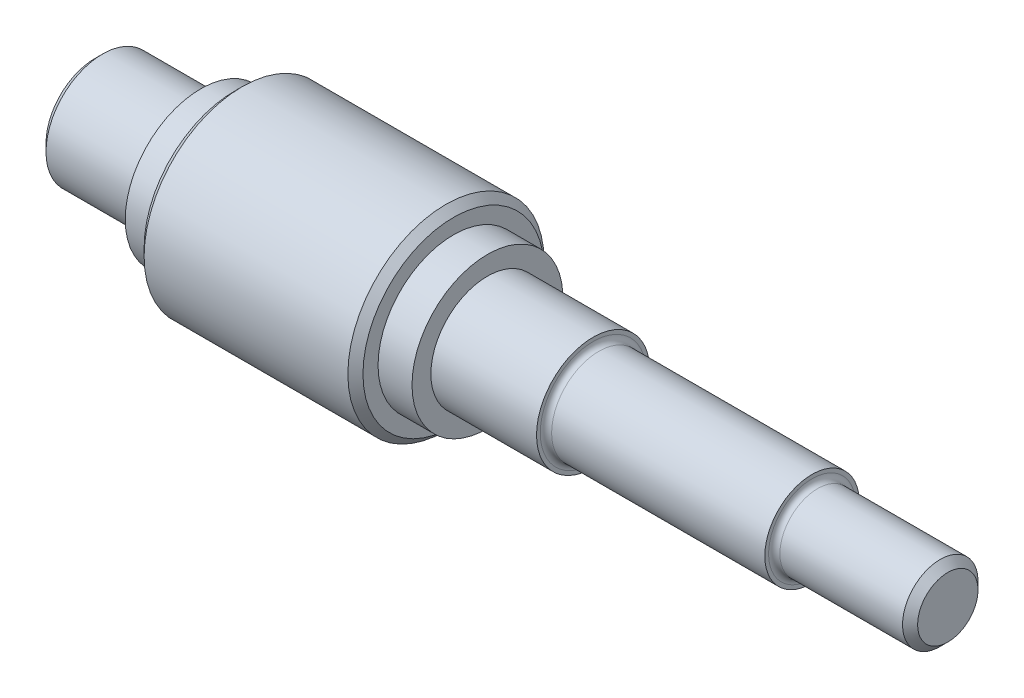
ISO-10303-21;
HEADER;
FILE_DESCRIPTION(('STEP AP214'),'2;1');
FILE_NAME('part.step','',(''),(''),'','','');
FILE_SCHEMA(('AUTOMOTIVE_DESIGN { 1 0 10303 214 1 1 1 1 }'));
ENDSEC;
DATA;
#1=APPLICATION_CONTEXT('core data for automotive mechanical design processes');
#2=APPLICATION_PROTOCOL_DEFINITION('international standard','automotive_design',2000,#1);
#3=PRODUCT_CONTEXT('',#1,'mechanical');
#4=PRODUCT('Part','Part','',(#3));
#5=PRODUCT_RELATED_PRODUCT_CATEGORY('part','',(#4));
#6=PRODUCT_DEFINITION_FORMATION('','',#4);
#7=PRODUCT_DEFINITION_CONTEXT('part definition',#1,'design');
#8=PRODUCT_DEFINITION('design','',#6,#7);
#9=PRODUCT_DEFINITION_SHAPE('','',#8);
#10=(LENGTH_UNIT() NAMED_UNIT(*) SI_UNIT(.MILLI.,.METRE.));
#11=(NAMED_UNIT(*) PLANE_ANGLE_UNIT() SI_UNIT($,.RADIAN.));
#12=(NAMED_UNIT(*) SI_UNIT($,.STERADIAN.) SOLID_ANGLE_UNIT());
#13=UNCERTAINTY_MEASURE_WITH_UNIT(LENGTH_MEASURE(1.E-05),#10,'distance_accuracy_value','');
#14=(GEOMETRIC_REPRESENTATION_CONTEXT(3) GLOBAL_UNCERTAINTY_ASSIGNED_CONTEXT((#13)) GLOBAL_UNIT_ASSIGNED_CONTEXT((#10,
#11,#12)) REPRESENTATION_CONTEXT('',''));
#15=CARTESIAN_POINT('',(0.,0.,0.));
#16=DIRECTION('',(0.,0.,1.));
#17=DIRECTION('',(1.,0.,0.));
#18=AXIS2_PLACEMENT_3D('',#15,#16,#17);
#19=CARTESIAN_POINT('',(-108.930747922438,0.,0.));
#20=DIRECTION('',(1.,0.,0.));
#21=DIRECTION('',(0.,0.,-1.));
#22=AXIS2_PLACEMENT_3D('',#19,#20,#21);
#23=PLANE('',#22);
#24=CARTESIAN_POINT('',(-108.930747922438,0.,0.));
#25=DIRECTION('',(-1.,0.,0.));
#26=DIRECTION('',(0.,0.,1.));
#27=AXIS2_PLACEMENT_3D('',#24,#25,#26);
#28=CIRCLE('',#27,13.);
#29=CARTESIAN_POINT('',(-108.930747922438,0.,13.));
#30=VERTEX_POINT('',#29);
#31=EDGE_CURVE('E159',#30,#30,#28,.T.);
#32=ORIENTED_EDGE('',*,*,#31,.T.);
#33=EDGE_LOOP('',(#32));
#34=FACE_BOUND('',#33,.T.);
#35=ADVANCED_FACE('F34',(#34),#23,.F.);
#36=CARTESIAN_POINT('',(-106.930747922438,0.,0.));
#37=DIRECTION('',(1.,0.,0.));
#38=DIRECTION('',(0.,0.,-1.));
#39=AXIS2_PLACEMENT_3D('',#36,#37,#38);
#40=CONICAL_SURFACE('',#39,15.,0.785398163397448);
#41=ORIENTED_EDGE('',*,*,#31,.F.);
#42=EDGE_LOOP('',(#41));
#43=FACE_BOUND('',#42,.T.);
#44=CARTESIAN_POINT('',(-106.930747922438,0.,0.));
#45=DIRECTION('',(-1.,0.,0.));
#46=DIRECTION('',(0.,0.,1.));
#47=AXIS2_PLACEMENT_3D('',#44,#45,#46);
#48=CIRCLE('',#47,15.);
#49=CARTESIAN_POINT('',(-106.930747922438,0.,15.));
#50=VERTEX_POINT('',#49);
#51=EDGE_CURVE('E156',#50,#50,#48,.T.);
#52=ORIENTED_EDGE('',*,*,#51,.T.);
#53=EDGE_LOOP('',(#52));
#54=FACE_BOUND('',#53,.T.);
#55=ADVANCED_FACE('F206',(#43,#54),#40,.T.);
#56=CARTESIAN_POINT('',(-108.930747922438,0.,0.));
#57=DIRECTION('',(-1.,0.,0.));
#58=DIRECTION('',(0.,0.,1.));
#59=AXIS2_PLACEMENT_3D('',#56,#57,#58);
#60=CYLINDRICAL_SURFACE('',#59,15.);
#61=ORIENTED_EDGE('',*,*,#51,.F.);
#62=EDGE_LOOP('',(#61));
#63=FACE_BOUND('',#62,.T.);
#64=CARTESIAN_POINT('',(-80.9307479224376,0.,0.));
#65=DIRECTION('',(-1.,0.,0.));
#66=DIRECTION('',(0.,0.,1.));
#67=AXIS2_PLACEMENT_3D('',#64,#65,#66);
#68=CIRCLE('',#67,15.);
#69=CARTESIAN_POINT('',(-80.9307479224376,0.,15.));
#70=VERTEX_POINT('',#69);
#71=EDGE_CURVE('E153',#70,#70,#68,.T.);
#72=ORIENTED_EDGE('',*,*,#71,.T.);
#73=EDGE_LOOP('',(#72));
#74=FACE_BOUND('',#73,.T.);
#75=ADVANCED_FACE('F211',(#63,#74),#60,.T.);
#76=CARTESIAN_POINT('',(-80.9307479224376,15.,0.));
#77=DIRECTION('',(1.,0.,0.));
#78=DIRECTION('',(0.,0.,-1.));
#79=AXIS2_PLACEMENT_3D('',#76,#77,#78);
#80=PLANE('',#79);
#81=ORIENTED_EDGE('',*,*,#71,.F.);
#82=EDGE_LOOP('',(#81));
#83=FACE_BOUND('',#82,.T.);
#84=CARTESIAN_POINT('',(-80.9307479224376,0.,0.));
#85=DIRECTION('',(-1.,0.,0.));
#86=DIRECTION('',(0.,0.,1.));
#87=AXIS2_PLACEMENT_3D('',#84,#85,#86);
#88=CIRCLE('',#87,20.);
#89=CARTESIAN_POINT('',(-80.9307479224376,0.,20.));
#90=VERTEX_POINT('',#89);
#91=EDGE_CURVE('E150',#90,#90,#88,.T.);
#92=ORIENTED_EDGE('',*,*,#91,.T.);
#93=EDGE_LOOP('',(#92));
#94=FACE_BOUND('',#93,.T.);
#95=ADVANCED_FACE('F219',(#83,#94),#80,.F.);
#96=CARTESIAN_POINT('',(-108.930747922438,0.,0.));
#97=DIRECTION('',(-1.,0.,0.));
#98=DIRECTION('',(0.,0.,1.));
#99=AXIS2_PLACEMENT_3D('',#96,#97,#98);
#100=CYLINDRICAL_SURFACE('',#99,20.);
#101=ORIENTED_EDGE('',*,*,#91,.F.);
#102=EDGE_LOOP('',(#101));
#103=FACE_BOUND('',#102,.T.);
#104=CARTESIAN_POINT('',(-71.9307479224377,0.,0.));
#105=DIRECTION('',(-1.,0.,0.));
#106=DIRECTION('',(0.,0.,1.));
#107=AXIS2_PLACEMENT_3D('',#104,#105,#106);
#108=CIRCLE('',#107,20.);
#109=CARTESIAN_POINT('',(-71.9307479224377,0.,20.));
#110=VERTEX_POINT('',#109);
#111=EDGE_CURVE('E147',#110,#110,#108,.T.);
#112=ORIENTED_EDGE('',*,*,#111,.T.);
#113=EDGE_LOOP('',(#112));
#114=FACE_BOUND('',#113,.T.);
#115=ADVANCED_FACE('F225',(#103,#114),#100,.T.);
#116=CARTESIAN_POINT('',(-71.9307479224377,20.,0.));
#117=DIRECTION('',(1.,0.,0.));
#118=DIRECTION('',(0.,0.,-1.));
#119=AXIS2_PLACEMENT_3D('',#116,#117,#118);
#120=PLANE('',#119);
#121=ORIENTED_EDGE('',*,*,#111,.F.);
#122=EDGE_LOOP('',(#121));
#123=FACE_BOUND('',#122,.T.);
#124=CARTESIAN_POINT('',(-71.9307479224377,0.,0.));
#125=DIRECTION('',(-1.,0.,0.));
#126=DIRECTION('',(0.,0.,1.));
#127=AXIS2_PLACEMENT_3D('',#124,#125,#126);
#128=CIRCLE('',#127,24.);
#129=CARTESIAN_POINT('',(-71.9307479224377,0.,24.));
#130=VERTEX_POINT('',#129);
#131=EDGE_CURVE('E144',#130,#130,#128,.T.);
#132=ORIENTED_EDGE('',*,*,#131,.T.);
#133=EDGE_LOOP('',(#132));
#134=FACE_BOUND('',#133,.T.);
#135=ADVANCED_FACE('F231',(#123,#134),#120,.F.);
#136=CARTESIAN_POINT('',(-69.9307479224377,0.,0.));
#137=DIRECTION('',(1.,0.,0.));
#138=DIRECTION('',(0.,0.,-1.));
#139=AXIS2_PLACEMENT_3D('',#136,#137,#138);
#140=CONICAL_SURFACE('',#139,26.,0.785398163397448);
#141=ORIENTED_EDGE('',*,*,#131,.F.);
#142=EDGE_LOOP('',(#141));
#143=FACE_BOUND('',#142,.T.);
#144=CARTESIAN_POINT('',(-69.9307479224377,0.,0.));
#145=DIRECTION('',(-1.,0.,0.));
#146=DIRECTION('',(0.,0.,1.));
#147=AXIS2_PLACEMENT_3D('',#144,#145,#146);
#148=CIRCLE('',#147,26.);
#149=CARTESIAN_POINT('',(-69.9307479224377,0.,26.));
#150=VERTEX_POINT('',#149);
#151=EDGE_CURVE('E141',#150,#150,#148,.T.);
#152=ORIENTED_EDGE('',*,*,#151,.T.);
#153=EDGE_LOOP('',(#152));
#154=FACE_BOUND('',#153,.T.);
#155=ADVANCED_FACE('F237',(#143,#154),#140,.T.);
#156=CARTESIAN_POINT('',(-108.930747922438,0.,0.));
#157=DIRECTION('',(-1.,0.,0.));
#158=DIRECTION('',(0.,0.,1.));
#159=AXIS2_PLACEMENT_3D('',#156,#157,#158);
#160=CYLINDRICAL_SURFACE('',#159,26.);
#161=ORIENTED_EDGE('',*,*,#151,.F.);
#162=EDGE_LOOP('',(#161));
#163=FACE_BOUND('',#162,.T.);
#164=CARTESIAN_POINT('',(-15.9307479224377,0.,0.));
#165=DIRECTION('',(-1.,0.,0.));
#166=DIRECTION('',(0.,0.,1.));
#167=AXIS2_PLACEMENT_3D('',#164,#165,#166);
#168=CIRCLE('',#167,26.);
#169=CARTESIAN_POINT('',(-15.9307479224377,0.,26.));
#170=VERTEX_POINT('',#169);
#171=EDGE_CURVE('E138',#170,#170,#168,.T.);
#172=ORIENTED_EDGE('',*,*,#171,.T.);
#173=EDGE_LOOP('',(#172));
#174=FACE_BOUND('',#173,.T.);
#175=ADVANCED_FACE('F243',(#163,#174),#160,.T.);
#176=CARTESIAN_POINT('',(-13.9307479224377,0.,0.));
#177=DIRECTION('',(-1.,0.,0.));
#178=DIRECTION('',(0.,0.,1.));
#179=AXIS2_PLACEMENT_3D('',#176,#177,#178);
#180=CONICAL_SURFACE('',#179,24.,0.785398163397448);
#181=ORIENTED_EDGE('',*,*,#171,.F.);
#182=EDGE_LOOP('',(#181));
#183=FACE_BOUND('',#182,.T.);
#184=CARTESIAN_POINT('',(-13.9307479224377,0.,0.));
#185=DIRECTION('',(-1.,0.,0.));
#186=DIRECTION('',(0.,0.,1.));
#187=AXIS2_PLACEMENT_3D('',#184,#185,#186);
#188=CIRCLE('',#187,24.);
#189=CARTESIAN_POINT('',(-13.9307479224377,0.,24.));
#190=VERTEX_POINT('',#189);
#191=EDGE_CURVE('E135',#190,#190,#188,.T.);
#192=ORIENTED_EDGE('',*,*,#191,.T.);
#193=EDGE_LOOP('',(#192));
#194=FACE_BOUND('',#193,.T.);
#195=ADVANCED_FACE('F249',(#183,#194),#180,.T.);
#196=CARTESIAN_POINT('',(-13.9307479224377,24.,0.));
#197=DIRECTION('',(-1.,0.,0.));
#198=DIRECTION('',(0.,0.,1.));
#199=AXIS2_PLACEMENT_3D('',#196,#197,#198);
#200=PLANE('',#199);
#201=ORIENTED_EDGE('',*,*,#191,.F.);
#202=EDGE_LOOP('',(#201));
#203=FACE_BOUND('',#202,.T.);
#204=CARTESIAN_POINT('',(-13.9307479224377,0.,0.));
#205=DIRECTION('',(-1.,0.,0.));
#206=DIRECTION('',(0.,0.,1.));
#207=AXIS2_PLACEMENT_3D('',#204,#205,#206);
#208=CIRCLE('',#207,20.);
#209=CARTESIAN_POINT('',(-13.9307479224377,0.,20.));
#210=VERTEX_POINT('',#209);
#211=EDGE_CURVE('E132',#210,#210,#208,.T.);
#212=ORIENTED_EDGE('',*,*,#211,.T.);
#213=EDGE_LOOP('',(#212));
#214=FACE_BOUND('',#213,.T.);
#215=ADVANCED_FACE('F255',(#203,#214),#200,.F.);
#216=CARTESIAN_POINT('',(-108.930747922438,0.,0.));
#217=DIRECTION('',(-1.,0.,0.));
#218=DIRECTION('',(0.,0.,1.));
#219=AXIS2_PLACEMENT_3D('',#216,#217,#218);
#220=CYLINDRICAL_SURFACE('',#219,20.);
#221=ORIENTED_EDGE('',*,*,#211,.F.);
#222=EDGE_LOOP('',(#221));
#223=FACE_BOUND('',#222,.T.);
#224=CARTESIAN_POINT('',(-4.93074792243765,0.,0.));
#225=DIRECTION('',(-1.,0.,0.));
#226=DIRECTION('',(0.,0.,1.));
#227=AXIS2_PLACEMENT_3D('',#224,#225,#226);
#228=CIRCLE('',#227,20.);
#229=CARTESIAN_POINT('',(-4.93074792243765,0.,20.));
#230=VERTEX_POINT('',#229);
#231=EDGE_CURVE('E129',#230,#230,#228,.T.);
#232=ORIENTED_EDGE('',*,*,#231,.T.);
#233=EDGE_LOOP('',(#232));
#234=FACE_BOUND('',#233,.T.);
#235=ADVANCED_FACE('F261',(#223,#234),#220,.T.);
#236=CARTESIAN_POINT('',(-4.93074792243766,20.,0.));
#237=DIRECTION('',(-1.,0.,0.));
#238=DIRECTION('',(0.,0.,1.));
#239=AXIS2_PLACEMENT_3D('',#236,#237,#238);
#240=PLANE('',#239);
#241=ORIENTED_EDGE('',*,*,#231,.F.);
#242=EDGE_LOOP('',(#241));
#243=FACE_BOUND('',#242,.T.);
#244=CARTESIAN_POINT('',(-4.93074792243765,0.,0.));
#245=DIRECTION('',(-1.,0.,0.));
#246=DIRECTION('',(0.,0.,1.));
#247=AXIS2_PLACEMENT_3D('',#244,#245,#246);
#248=CIRCLE('',#247,15.);
#249=CARTESIAN_POINT('',(-4.93074792243765,0.,15.));
#250=VERTEX_POINT('',#249);
#251=EDGE_CURVE('E126',#250,#250,#248,.T.);
#252=ORIENTED_EDGE('',*,*,#251,.T.);
#253=EDGE_LOOP('',(#252));
#254=FACE_BOUND('',#253,.T.);
#255=ADVANCED_FACE('F267',(#243,#254),#240,.F.);
#256=CARTESIAN_POINT('',(-108.930747922438,0.,0.));
#257=DIRECTION('',(-1.,0.,0.));
#258=DIRECTION('',(0.,0.,1.));
#259=AXIS2_PLACEMENT_3D('',#256,#257,#258);
#260=CYLINDRICAL_SURFACE('',#259,15.);
#261=ORIENTED_EDGE('',*,*,#251,.F.);
#262=EDGE_LOOP('',(#261));
#263=FACE_BOUND('',#262,.T.);
#264=CARTESIAN_POINT('',(23.0692520775623,0.,0.));
#265=DIRECTION('',(-1.,0.,0.));
#266=DIRECTION('',(0.,0.,1.));
#267=AXIS2_PLACEMENT_3D('',#264,#265,#266);
#268=CIRCLE('',#267,15.);
#269=CARTESIAN_POINT('',(23.0692520775623,0.,15.));
#270=VERTEX_POINT('',#269);
#271=EDGE_CURVE('E123',#270,#270,#268,.T.);
#272=ORIENTED_EDGE('',*,*,#271,.T.);
#273=EDGE_LOOP('',(#272));
#274=FACE_BOUND('',#273,.T.);
#275=ADVANCED_FACE('F273',(#263,#274),#260,.T.);
#276=CARTESIAN_POINT('',(23.0692520775623,15.,0.));
#277=DIRECTION('',(-1.,0.,0.));
#278=DIRECTION('',(0.,0.,1.));
#279=AXIS2_PLACEMENT_3D('',#276,#277,#278);
#280=PLANE('',#279);
#281=ORIENTED_EDGE('',*,*,#271,.F.);
#282=EDGE_LOOP('',(#281));
#283=FACE_BOUND('',#282,.T.);
#284=CARTESIAN_POINT('',(23.0692520775623,0.,0.));
#285=DIRECTION('',(-1.,0.,0.));
#286=DIRECTION('',(0.,0.,1.));
#287=AXIS2_PLACEMENT_3D('',#284,#285,#286);
#288=CIRCLE('',#287,14.);
#289=CARTESIAN_POINT('',(23.0692520775623,0.,14.));
#290=VERTEX_POINT('',#289);
#291=EDGE_CURVE('E120',#290,#290,#288,.T.);
#292=ORIENTED_EDGE('',*,*,#291,.T.);
#293=EDGE_LOOP('',(#292));
#294=FACE_BOUND('',#293,.T.);
#295=ADVANCED_FACE('F279',(#283,#294),#280,.F.);
#296=CARTESIAN_POINT('',(24.5692520775623,0.,0.));
#297=DIRECTION('',(-1.,0.,0.));
#298=DIRECTION('',(0.,0.,1.));
#299=AXIS2_PLACEMENT_3D('',#296,#297,#298);
#300=TOROIDAL_SURFACE('',#299,14.,1.5);
#301=ORIENTED_EDGE('',*,*,#291,.F.);
#302=EDGE_LOOP('',(#301));
#303=FACE_BOUND('',#302,.T.);
#304=CARTESIAN_POINT('',(24.5692520775623,0.,0.));
#305=DIRECTION('',(-1.,0.,0.));
#306=DIRECTION('',(0.,0.,1.));
#307=AXIS2_PLACEMENT_3D('',#304,#305,#306);
#308=CIRCLE('',#307,12.5);
#309=CARTESIAN_POINT('',(24.5692520775623,0.,12.5));
#310=VERTEX_POINT('',#309);
#311=EDGE_CURVE('E117',#310,#310,#308,.T.);
#312=ORIENTED_EDGE('',*,*,#311,.T.);
#313=EDGE_LOOP('',(#312));
#314=FACE_BOUND('',#313,.T.);
#315=ADVANCED_FACE('F285',(#303,#314),#300,.F.);
#316=CARTESIAN_POINT('',(-108.930747922438,0.,0.));
#317=DIRECTION('',(-1.,0.,0.));
#318=DIRECTION('',(0.,0.,1.));
#319=AXIS2_PLACEMENT_3D('',#316,#317,#318);
#320=CYLINDRICAL_SURFACE('',#319,12.5);
#321=ORIENTED_EDGE('',*,*,#311,.F.);
#322=EDGE_LOOP('',(#321));
#323=FACE_BOUND('',#322,.T.);
#324=CARTESIAN_POINT('',(81.0692520775623,0.,0.));
#325=DIRECTION('',(-1.,0.,0.));
#326=DIRECTION('',(0.,0.,1.));
#327=AXIS2_PLACEMENT_3D('',#324,#325,#326);
#328=CIRCLE('',#327,12.5);
#329=CARTESIAN_POINT('',(81.0692520775623,0.,12.5));
#330=VERTEX_POINT('',#329);
#331=EDGE_CURVE('E114',#330,#330,#328,.T.);
#332=ORIENTED_EDGE('',*,*,#331,.T.);
#333=EDGE_LOOP('',(#332));
#334=FACE_BOUND('',#333,.T.);
#335=ADVANCED_FACE('F291',(#323,#334),#320,.T.);
#336=CARTESIAN_POINT('',(81.0692520775624,12.5,0.));
#337=DIRECTION('',(-1.,0.,0.));
#338=DIRECTION('',(0.,0.,1.));
#339=AXIS2_PLACEMENT_3D('',#336,#337,#338);
#340=PLANE('',#339);
#341=ORIENTED_EDGE('',*,*,#331,.F.);
#342=EDGE_LOOP('',(#341));
#343=FACE_BOUND('',#342,.T.);
#344=CARTESIAN_POINT('',(81.0692520775623,0.,0.));
#345=DIRECTION('',(-1.,0.,0.));
#346=DIRECTION('',(0.,0.,1.));
#347=AXIS2_PLACEMENT_3D('',#344,#345,#346);
#348=CIRCLE('',#347,11.5);
#349=CARTESIAN_POINT('',(81.0692520775623,0.,11.5));
#350=VERTEX_POINT('',#349);
#351=EDGE_CURVE('E111',#350,#350,#348,.T.);
#352=ORIENTED_EDGE('',*,*,#351,.T.);
#353=EDGE_LOOP('',(#352));
#354=FACE_BOUND('',#353,.T.);
#355=ADVANCED_FACE('F297',(#343,#354),#340,.F.);
#356=CARTESIAN_POINT('',(82.5692520775624,0.,0.));
#357=DIRECTION('',(-1.,0.,0.));
#358=DIRECTION('',(0.,0.,1.));
#359=AXIS2_PLACEMENT_3D('',#356,#357,#358);
#360=TOROIDAL_SURFACE('',#359,11.5,1.5);
#361=ORIENTED_EDGE('',*,*,#351,.F.);
#362=EDGE_LOOP('',(#361));
#363=FACE_BOUND('',#362,.T.);
#364=CARTESIAN_POINT('',(82.5692520775624,0.,0.));
#365=DIRECTION('',(-1.,0.,0.));
#366=DIRECTION('',(0.,0.,1.));
#367=AXIS2_PLACEMENT_3D('',#364,#365,#366);
#368=CIRCLE('',#367,10.);
#369=CARTESIAN_POINT('',(82.5692520775624,0.,10.));
#370=VERTEX_POINT('',#369);
#371=EDGE_CURVE('E108',#370,#370,#368,.T.);
#372=ORIENTED_EDGE('',*,*,#371,.T.);
#373=EDGE_LOOP('',(#372));
#374=FACE_BOUND('',#373,.T.);
#375=ADVANCED_FACE('F201',(#363,#374),#360,.F.);
#376=CARTESIAN_POINT('',(-108.930747922438,0.,0.));
#377=DIRECTION('',(-1.,0.,0.));
#378=DIRECTION('',(0.,0.,1.));
#379=AXIS2_PLACEMENT_3D('',#376,#377,#378);
#380=CYLINDRICAL_SURFACE('',#379,10.);
#381=DIRECTION('',(-1.,0.,0.));
#382=VECTOR('',#381,1.);
#383=CARTESIAN_POINT('',(-108.930747922438,-2.99999999999997,-9.53939201416947));
#384=LINE('',#383,#382);
#385=CARTESIAN_POINT('',(88.8086708220053,-3.,-9.53939201416947));
#386=VERTEX_POINT('',#385);
#387=CARTESIAN_POINT('',(110.808670822005,-3.,-9.53939201416945));
#388=VERTEX_POINT('',#387);
#389=EDGE_CURVE('E11',#386,#388,#384,.F.);
#390=ORIENTED_EDGE('',*,*,#389,.T.);
#391=CARTESIAN_POINT('',(110.808670822005,-3.,-9.53939201416945));
#392=CARTESIAN_POINT('',(110.891006342828,-3.00001027845728,-9.53938054248206));
#393=CARTESIAN_POINT('',(110.973335277069,-2.99661062684472,-9.54045772064378));
#394=CARTESIAN_POINT('',(111.137364774771,-2.98307142899347,-9.54470412105986));
#395=CARTESIAN_POINT('',(111.21906547533,-2.97293339805418,-9.54787287296848));
#396=CARTESIAN_POINT('',(111.381055737678,-2.94603140625045,-9.55620668351003));
#397=CARTESIAN_POINT('',(111.461348346048,-2.92928426957737,-9.56136667250114));
#398=CARTESIAN_POINT('',(111.620146666139,-2.88932853030395,-9.57351626651178));
#399=CARTESIAN_POINT('',(111.698652331073,-2.8661197587264,-9.58050591937828));
#400=CARTESIAN_POINT('',(111.930620209995,-2.78708584446024,-9.60391637654136));
#401=CARTESIAN_POINT('',(112.080739260838,-2.72181852542972,-9.6227900783039));
#402=CARTESIAN_POINT('',(112.367896865984,-2.56815043531276,-9.66493213967819));
#403=CARTESIAN_POINT('',(112.504929292767,-2.4797388992416,-9.6882025429064));
#404=CARTESIAN_POINT('',(112.766393809953,-2.27929879634443,-9.73733650515374));
#405=CARTESIAN_POINT('',(112.890355696066,-2.16666914746584,-9.76325505469873));
#406=CARTESIAN_POINT('',(113.117944436844,-1.92227736150433,-9.81429628475077));
#407=CARTESIAN_POINT('',(113.221567855866,-1.79051199848164,-9.8394188301941));
#408=CARTESIAN_POINT('',(113.4075976871,-1.50821997465697,-9.88666477976534));
#409=CARTESIAN_POINT('',(113.489521001788,-1.35736167401015,-9.90871541546877));
#410=CARTESIAN_POINT('',(113.626647826008,-1.04324233568302,-9.94668940088144));
#411=CARTESIAN_POINT('',(113.681858225373,-0.879984508687983,-9.96261433032402));
#412=CARTESIAN_POINT('',(113.762430373796,-0.550649404820601,-9.98615279768397));
#413=CARTESIAN_POINT('',(113.788600525523,-0.384786253016201,-9.99399098526792));
#414=CARTESIAN_POINT('',(113.812905517151,-0.0508471415689244,-10.0012640407204));
#415=CARTESIAN_POINT('',(113.811045664683,0.117228393125342,-10.0007004995012));
#416=CARTESIAN_POINT('',(113.779885001314,0.445143199271828,-9.99139205125586));
#417=CARTESIAN_POINT('',(113.751460131197,0.605074290763032,-9.98290831016512));
#418=CARTESIAN_POINT('',(113.66940755238,0.917780104370316,-9.95903027401822));
#419=CARTESIAN_POINT('',(113.615778523323,1.07055445110879,-9.94363561692558));
#420=CARTESIAN_POINT('',(113.484246378481,1.36669563173912,-9.90730429851782));
#421=CARTESIAN_POINT('',(113.406067533229,1.50993201207613,-9.88630511384914));
#422=CARTESIAN_POINT('',(113.227873641971,1.78153105916101,-9.84099249303646));
#423=CARTESIAN_POINT('',(113.127853703065,1.90989038323251,-9.81667831471805));
#424=CARTESIAN_POINT('',(112.904286845821,2.15330901082205,-9.7662334714278));
#425=CARTESIAN_POINT('',(112.779983094479,2.26766702955975,-9.74006890899097));
#426=CARTESIAN_POINT('',(112.513675975154,2.47413538985067,-9.68968430229327));
#427=CARTESIAN_POINT('',(112.371667461275,2.5662392402618,-9.66546482675133));
#428=CARTESIAN_POINT('',(112.072108965105,2.72632814481701,-9.62154457591303));
#429=CARTESIAN_POINT('',(111.914416462818,2.79406012682262,-9.60189192491895));
#430=CARTESIAN_POINT('',(111.589221814042,2.90171772009404,-9.56991327306402));
#431=CARTESIAN_POINT('',(111.421735100577,2.94168586436072,-9.55757606951749));
#432=CARTESIAN_POINT('',(111.178681043865,2.97802407180159,-9.54628064650011));
#433=CARTESIAN_POINT('',(111.104889353646,2.98626405978017,-9.54370312550533));
#434=CARTESIAN_POINT('',(110.956967863806,2.99724711229708,-9.54025857223564));
#435=CARTESIAN_POINT('',(110.882838722678,2.99999825936538,-9.53938902493288));
#436=CARTESIAN_POINT('',(110.808670822005,3.,-9.53939201416945));
#437=B_SPLINE_CURVE_WITH_KNOTS('',3,(#391,#392,#393,#394,#395,#396,#397,#398,#399,#400,#401,
#402,#403,#404,#405,#406,#407,#408,#409,#410,#411,#412,#413,#414,#415,#416,#417,#418,#419,#420,
#421,#422,#423,#424,#425,#426,#427,#428,#429,#430,#431,#432,#433,#434,#435,#436),.UNSPECIFIED.,
.F.,.F.,(4,2,2,2,2,2,2,2,2,2,2,2,2,2,2,2,2,2,2,2,2,2,4),(0.,0.246918142439474,0.493780777706094,
0.740019009623012,0.986263681482027,1.47813347402025,1.97023245590778,2.47635119822767,
2.98255536239033,3.49922810620071,4.01576751791672,4.51753600864764,5.01920948804101,
5.50490358251093,5.99062312360832,6.48200583350621,6.9734987373917,7.48389234847122,
7.99443465298715,8.51013494368214,9.02504345105574,9.24774267716777,9.47011372732391),.UNSPECIFIED.);
#438=CARTESIAN_POINT('',(110.808670822005,3.,-9.53939201416945));
#439=VERTEX_POINT('',#438);
#440=EDGE_CURVE('E162',#388,#439,#437,.T.);
#441=ORIENTED_EDGE('',*,*,#440,.T.);
#442=DIRECTION('',(-1.,0.,0.));
#443=VECTOR('',#442,1.);
#444=CARTESIAN_POINT('',(-108.930747922438,3.00000000000001,-9.53939201416945));
#445=LINE('',#444,#443);
#446=CARTESIAN_POINT('',(88.8086708220053,3.00000000000001,-9.53939201416945));
#447=VERTEX_POINT('',#446);
#448=EDGE_CURVE('E41',#439,#447,#445,.T.);
#449=ORIENTED_EDGE('',*,*,#448,.T.);
#450=CARTESIAN_POINT('',(88.8086708220053,3.,-9.53939201416945));
#451=CARTESIAN_POINT('',(88.7263353011826,3.00001027845728,-9.53938054248206));
#452=CARTESIAN_POINT('',(88.644006366942,2.99661062684473,-9.54045772064378));
#453=CARTESIAN_POINT('',(88.4799768692398,2.98307142899347,-9.54470412105986));
#454=CARTESIAN_POINT('',(88.3982761686809,2.97293339805419,-9.54787287296848));
#455=CARTESIAN_POINT('',(88.2362859063321,2.94603140625045,-9.55620668351003));
#456=CARTESIAN_POINT('',(88.1559932979622,2.92928426957738,-9.56136667250114));
#457=CARTESIAN_POINT('',(87.997194977871,2.88932853030395,-9.57351626651178));
#458=CARTESIAN_POINT('',(87.9186893129379,2.86611975872641,-9.58050591937827));
#459=CARTESIAN_POINT('',(87.6867214340151,2.78708584446025,-9.60391637654136));
#460=CARTESIAN_POINT('',(87.5366023831723,2.72181852542973,-9.6227900783039));
#461=CARTESIAN_POINT('',(87.2494447780262,2.56815043531277,-9.66493213967819));
#462=CARTESIAN_POINT('',(87.1124123512431,2.47973889924161,-9.6882025429064));
#463=CARTESIAN_POINT('',(86.8509478340575,2.27929879634443,-9.73733650515374));
#464=CARTESIAN_POINT('',(86.7269859479444,2.16666914746585,-9.76325505469874));
#465=CARTESIAN_POINT('',(86.4993972071665,1.92227736150434,-9.81429628475077));
#466=CARTESIAN_POINT('',(86.3957737881443,1.79051199848164,-9.83941883019409));
#467=CARTESIAN_POINT('',(86.2097439569107,1.50821997465697,-9.88666477976534));
#468=CARTESIAN_POINT('',(86.1278206422227,1.35736167401016,-9.90871541546877));
#469=CARTESIAN_POINT('',(85.9906938180024,1.04324233568303,-9.94668940088144));
#470=CARTESIAN_POINT('',(85.9354834186373,0.879984508687988,-9.96261433032402));
#471=CARTESIAN_POINT('',(85.8549112702143,0.550649404820606,-9.98615279768397));
#472=CARTESIAN_POINT('',(85.8287411184877,0.384786253016206,-9.99399098526792));
#473=CARTESIAN_POINT('',(85.8044361268592,0.05084714156893,-10.0012640407204));
#474=CARTESIAN_POINT('',(85.8062959793271,-0.117228393125337,-10.0007004995012));
#475=CARTESIAN_POINT('',(85.8374566426967,-0.445143199271823,-9.99139205125586));
#476=CARTESIAN_POINT('',(85.8658815128134,-0.605074290763027,-9.98290831016512));
#477=CARTESIAN_POINT('',(85.9479340916308,-0.917780104370311,-9.95903027401822));
#478=CARTESIAN_POINT('',(86.0015631206879,-1.07055445110878,-9.94363561692558));
#479=CARTESIAN_POINT('',(86.13309526553,-1.36669563173911,-9.90730429851782));
#480=CARTESIAN_POINT('',(86.2112741107814,-1.50993201207612,-9.88630511384915));
#481=CARTESIAN_POINT('',(86.3894680020397,-1.781531059161,-9.84099249303646));
#482=CARTESIAN_POINT('',(86.489487940946,-1.9098903832325,-9.81667831471806));
#483=CARTESIAN_POINT('',(86.7130547981899,-2.15330901082205,-9.7662334714278));
#484=CARTESIAN_POINT('',(86.8373585495315,-2.26766702955975,-9.74006890899097));
#485=CARTESIAN_POINT('',(87.1036656688564,-2.47413538985066,-9.68968430229327));
#486=CARTESIAN_POINT('',(87.2456741827351,-2.56623924026179,-9.66546482675134));
#487=CARTESIAN_POINT('',(87.5452326789051,-2.726328144817,-9.62154457591303));
#488=CARTESIAN_POINT('',(87.7029251811924,-2.79406012682262,-9.60189192491895));
#489=CARTESIAN_POINT('',(88.0281198299684,-2.90171772009404,-9.56991327306402));
#490=CARTESIAN_POINT('',(88.195606543434,-2.94168586436071,-9.55757606951749));
#491=CARTESIAN_POINT('',(88.4386606001457,-2.97802407180158,-9.54628064650012));
#492=CARTESIAN_POINT('',(88.5124522903645,-2.98626405978017,-9.54370312550533));
#493=CARTESIAN_POINT('',(88.6603737802043,-2.99724711229708,-9.54025857223564));
#494=CARTESIAN_POINT('',(88.734502921333,-2.99999825936537,-9.53938902493288));
#495=CARTESIAN_POINT('',(88.8086708220053,-2.99999999999999,-9.53939201416946));
#496=B_SPLINE_CURVE_WITH_KNOTS('',3,(#450,#451,#452,#453,#454,#455,#456,#457,#458,#459,#460,
#461,#462,#463,#464,#465,#466,#467,#468,#469,#470,#471,#472,#473,#474,#475,#476,#477,#478,#479,
#480,#481,#482,#483,#484,#485,#486,#487,#488,#489,#490,#491,#492,#493,#494,#495),.UNSPECIFIED.,
.F.,.F.,(4,2,2,2,2,2,2,2,2,2,2,2,2,2,2,2,2,2,2,2,2,2,4),(0.,0.246918142439474,0.493780777706094,
0.740019009623012,0.986263681482027,1.47813347402025,1.97023245590778,2.47635119822767,
2.98255536239033,3.49922810620071,4.01576751791672,4.51753600864764,5.01920948804101,
5.50490358251093,5.99062312360831,6.48200583350621,6.9734987373917,7.48389234847122,
7.99443465298715,8.51013494368213,9.02504345105574,9.24774267716779,9.47011372732391),.UNSPECIFIED.);
#497=EDGE_CURVE('E48',#447,#386,#496,.T.);
#498=ORIENTED_EDGE('',*,*,#497,.T.);
#499=EDGE_LOOP('',(#390,#441,#449,#498));
#500=FACE_BOUND('',#499,.T.);
#501=ORIENTED_EDGE('',*,*,#371,.F.);
#502=EDGE_LOOP('',(#501));
#503=FACE_BOUND('',#502,.T.);
#504=CARTESIAN_POINT('',(115.069252077562,0.,0.));
#505=DIRECTION('',(-1.,0.,0.));
#506=DIRECTION('',(0.,0.,1.));
#507=AXIS2_PLACEMENT_3D('',#504,#505,#506);
#508=CIRCLE('',#507,10.);
#509=CARTESIAN_POINT('',(115.069252077562,0.,10.));
#510=VERTEX_POINT('',#509);
#511=EDGE_CURVE('E105',#510,#510,#508,.T.);
#512=ORIENTED_EDGE('',*,*,#511,.T.);
#513=EDGE_LOOP('',(#512));
#514=FACE_BOUND('',#513,.T.);
#515=ADVANCED_FACE('F176',(#500,#503,#514),#380,.T.);
#516=CARTESIAN_POINT('',(117.069252077562,0.,0.));
#517=DIRECTION('',(-1.,0.,0.));
#518=DIRECTION('',(0.,0.,1.));
#519=AXIS2_PLACEMENT_3D('',#516,#517,#518);
#520=CONICAL_SURFACE('',#519,8.,0.785398163397448);
#521=ORIENTED_EDGE('',*,*,#511,.F.);
#522=EDGE_LOOP('',(#521));
#523=FACE_BOUND('',#522,.T.);
#524=CARTESIAN_POINT('',(117.069252077562,0.,0.));
#525=DIRECTION('',(-1.,0.,0.));
#526=DIRECTION('',(0.,0.,1.));
#527=AXIS2_PLACEMENT_3D('',#524,#525,#526);
#528=CIRCLE('',#527,8.);
#529=CARTESIAN_POINT('',(117.069252077562,0.,8.));
#530=VERTEX_POINT('',#529);
#531=EDGE_CURVE('E99',#530,#530,#528,.T.);
#532=ORIENTED_EDGE('',*,*,#531,.T.);
#533=EDGE_LOOP('',(#532));
#534=FACE_BOUND('',#533,.T.);
#535=ADVANCED_FACE('F194',(#523,#534),#520,.T.);
#536=CARTESIAN_POINT('',(117.069252077562,8.,0.));
#537=DIRECTION('',(-1.,0.,0.));
#538=DIRECTION('',(0.,0.,1.));
#539=AXIS2_PLACEMENT_3D('',#536,#537,#538);
#540=PLANE('',#539);
#541=ORIENTED_EDGE('',*,*,#531,.F.);
#542=EDGE_LOOP('',(#541));
#543=FACE_BOUND('',#542,.T.);
#544=ADVANCED_FACE('F192',(#543),#540,.F.);
#545=CARTESIAN_POINT('',(88.8086708220053,0.,-6.5));
#546=DIRECTION('',(0.,0.,-1.));
#547=DIRECTION('',(-1.,0.,0.));
#548=AXIS2_PLACEMENT_3D('',#545,#546,#547);
#549=CYLINDRICAL_SURFACE('',#548,3.);
#550=DIRECTION('',(0.,0.,-1.));
#551=VECTOR('',#550,1.);
#552=CARTESIAN_POINT('',(88.8086708220053,3.,-6.5));
#553=LINE('',#552,#551);
#554=CARTESIAN_POINT('',(88.8086708220053,3.,-6.5));
#555=VERTEX_POINT('',#554);
#556=EDGE_CURVE('E71',#555,#447,#553,.T.);
#557=ORIENTED_EDGE('',*,*,#556,.F.);
#558=CARTESIAN_POINT('',(88.8086708220053,0.,-6.5));
#559=DIRECTION('',(0.,0.,-1.));
#560=DIRECTION('',(-1.,0.,0.));
#561=AXIS2_PLACEMENT_3D('',#558,#559,#560);
#562=CIRCLE('',#561,3.);
#563=CARTESIAN_POINT('',(88.8086708220053,-3.,-6.5));
#564=VERTEX_POINT('',#563);
#565=EDGE_CURVE('E75',#564,#555,#562,.T.);
#566=ORIENTED_EDGE('',*,*,#565,.F.);
#567=DIRECTION('',(0.,0.,-1.));
#568=VECTOR('',#567,1.);
#569=CARTESIAN_POINT('',(88.8086708220053,-3.,-6.5));
#570=LINE('',#569,#568);
#571=EDGE_CURVE('E97',#564,#386,#570,.T.);
#572=ORIENTED_EDGE('',*,*,#571,.T.);
#573=ORIENTED_EDGE('',*,*,#497,.F.);
#574=EDGE_LOOP('',(#557,#566,#572,#573));
#575=FACE_BOUND('',#574,.T.);
#576=ADVANCED_FACE('F73',(#575),#549,.F.);
#577=CARTESIAN_POINT('',(110.808670822005,-3.,-6.5));
#578=DIRECTION('',(0.,-1.,0.));
#579=DIRECTION('',(1.,0.,0.));
#580=AXIS2_PLACEMENT_3D('',#577,#578,#579);
#581=PLANE('',#580);
#582=ORIENTED_EDGE('',*,*,#571,.F.);
#583=DIRECTION('',(-1.,0.,0.));
#584=VECTOR('',#583,1.);
#585=CARTESIAN_POINT('',(110.808670822005,-3.,-6.5));
#586=LINE('',#585,#584);
#587=CARTESIAN_POINT('',(110.808670822005,-3.,-6.5));
#588=VERTEX_POINT('',#587);
#589=EDGE_CURVE('E80',#588,#564,#586,.T.);
#590=ORIENTED_EDGE('',*,*,#589,.F.);
#591=DIRECTION('',(0.,0.,-1.));
#592=VECTOR('',#591,1.);
#593=CARTESIAN_POINT('',(110.808670822005,-3.,-6.5));
#594=LINE('',#593,#592);
#595=EDGE_CURVE('E100',#588,#388,#594,.T.);
#596=ORIENTED_EDGE('',*,*,#595,.T.);
#597=ORIENTED_EDGE('',*,*,#389,.F.);
#598=EDGE_LOOP('',(#582,#590,#596,#597));
#599=FACE_BOUND('',#598,.T.);
#600=ADVANCED_FACE('F185',(#599),#581,.F.);
#601=CARTESIAN_POINT('',(110.808670822005,0.,-6.5));
#602=DIRECTION('',(0.,0.,-1.));
#603=DIRECTION('',(-1.,0.,0.));
#604=AXIS2_PLACEMENT_3D('',#601,#602,#603);
#605=CYLINDRICAL_SURFACE('',#604,3.);
#606=ORIENTED_EDGE('',*,*,#595,.F.);
#607=CARTESIAN_POINT('',(110.808670822005,0.,-6.5));
#608=DIRECTION('',(0.,0.,-1.));
#609=DIRECTION('',(-1.,0.,0.));
#610=AXIS2_PLACEMENT_3D('',#607,#608,#609);
#611=CIRCLE('',#610,3.);
#612=CARTESIAN_POINT('',(110.808670822005,3.,-6.5));
#613=VERTEX_POINT('',#612);
#614=EDGE_CURVE('E89',#613,#588,#611,.T.);
#615=ORIENTED_EDGE('',*,*,#614,.F.);
#616=DIRECTION('',(0.,0.,-1.));
#617=VECTOR('',#616,1.);
#618=CARTESIAN_POINT('',(110.808670822005,3.,-6.5));
#619=LINE('',#618,#617);
#620=EDGE_CURVE('E79',#613,#439,#619,.T.);
#621=ORIENTED_EDGE('',*,*,#620,.T.);
#622=ORIENTED_EDGE('',*,*,#440,.F.);
#623=EDGE_LOOP('',(#606,#615,#621,#622));
#624=FACE_BOUND('',#623,.T.);
#625=ADVANCED_FACE('F180',(#624),#605,.F.);
#626=CARTESIAN_POINT('',(110.808670822005,3.,-6.5));
#627=DIRECTION('',(0.,1.,0.));
#628=DIRECTION('',(-1.,0.,0.));
#629=AXIS2_PLACEMENT_3D('',#626,#627,#628);
#630=PLANE('',#629);
#631=ORIENTED_EDGE('',*,*,#620,.F.);
#632=DIRECTION('',(1.,0.,0.));
#633=VECTOR('',#632,1.);
#634=CARTESIAN_POINT('',(110.808670822005,3.,-6.5));
#635=LINE('',#634,#633);
#636=EDGE_CURVE('E83',#555,#613,#635,.T.);
#637=ORIENTED_EDGE('',*,*,#636,.F.);
#638=ORIENTED_EDGE('',*,*,#556,.T.);
#639=ORIENTED_EDGE('',*,*,#448,.F.);
#640=EDGE_LOOP('',(#631,#637,#638,#639));
#641=FACE_BOUND('',#640,.T.);
#642=ADVANCED_FACE('F84',(#641),#630,.F.);
#643=CARTESIAN_POINT('',(88.8086708220053,0.,-6.5));
#644=DIRECTION('',(0.,0.,-1.));
#645=DIRECTION('',(-1.,0.,0.));
#646=AXIS2_PLACEMENT_3D('',#643,#644,#645);
#647=PLANE('',#646);
#648=ORIENTED_EDGE('',*,*,#565,.T.);
#649=ORIENTED_EDGE('',*,*,#636,.T.);
#650=ORIENTED_EDGE('',*,*,#614,.T.);
#651=ORIENTED_EDGE('',*,*,#589,.T.);
#652=EDGE_LOOP('',(#648,#649,#650,#651));
#653=FACE_BOUND('',#652,.T.);
#654=ADVANCED_FACE('F91',(#653),#647,.T.);
#655=CLOSED_SHELL('',(#35,#55,#75,#95,#115,#135,#155,#175,#195,#215,#235,#255,#275,#295,#315,
#335,#355,#375,#515,#535,#544,#576,#600,#625,#642,#654));
#656=MANIFOLD_SOLID_BREP('B2',#655);
#657=ADVANCED_BREP_SHAPE_REPRESENTATION('',(#18,#656),#14);
#658=SHAPE_DEFINITION_REPRESENTATION(#9,#657);
ENDSEC;
END-ISO-10303-21;
